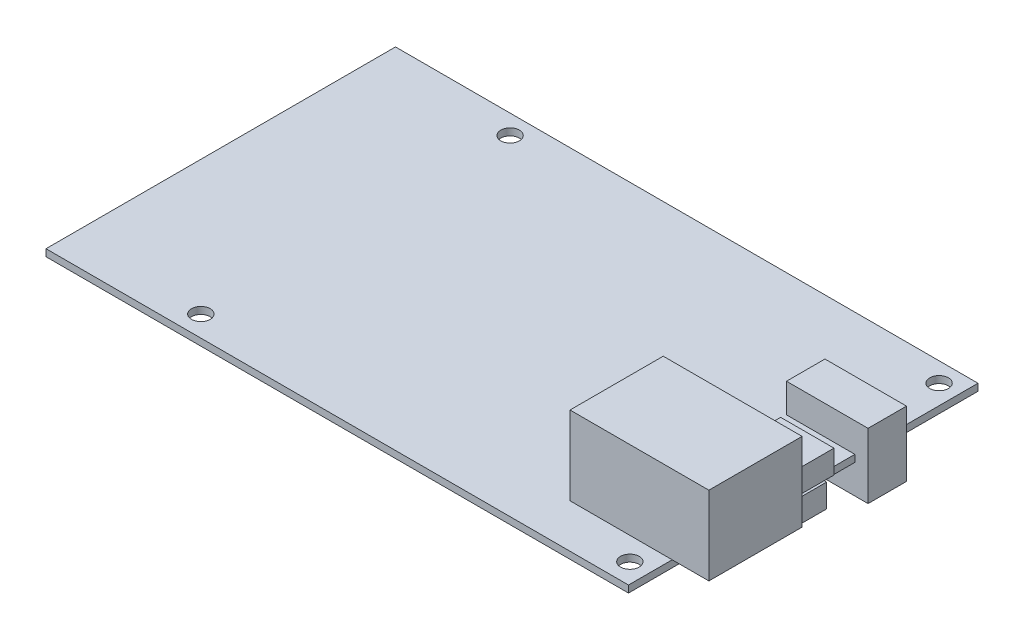
ISO-10303-21;
HEADER;
FILE_DESCRIPTION(('STEP AP214'),'2;1');
FILE_NAME('part.step','',(''),(''),'','','');
FILE_SCHEMA(('AUTOMOTIVE_DESIGN { 1 0 10303 214 1 1 1 1 }'));
ENDSEC;
DATA;
#1=APPLICATION_CONTEXT('core data for automotive mechanical design processes');
#2=APPLICATION_PROTOCOL_DEFINITION('international standard','automotive_design',2000,#1);
#3=PRODUCT_CONTEXT('',#1,'mechanical');
#4=PRODUCT('Part','Part','',(#3));
#5=PRODUCT_RELATED_PRODUCT_CATEGORY('part','',(#4));
#6=PRODUCT_DEFINITION_FORMATION('','',#4);
#7=PRODUCT_DEFINITION_CONTEXT('part definition',#1,'design');
#8=PRODUCT_DEFINITION('design','',#6,#7);
#9=PRODUCT_DEFINITION_SHAPE('','',#8);
#10=(LENGTH_UNIT() NAMED_UNIT(*) SI_UNIT(.MILLI.,.METRE.));
#11=(NAMED_UNIT(*) PLANE_ANGLE_UNIT() SI_UNIT($,.RADIAN.));
#12=(NAMED_UNIT(*) SI_UNIT($,.STERADIAN.) SOLID_ANGLE_UNIT());
#13=UNCERTAINTY_MEASURE_WITH_UNIT(LENGTH_MEASURE(1.E-05),#10,'distance_accuracy_value','');
#14=(GEOMETRIC_REPRESENTATION_CONTEXT(3) GLOBAL_UNCERTAINTY_ASSIGNED_CONTEXT((#13)) GLOBAL_UNIT_ASSIGNED_CONTEXT((#10,
#11,#12)) REPRESENTATION_CONTEXT('',''));
#15=CARTESIAN_POINT('',(0.,0.,0.));
#16=DIRECTION('',(0.,0.,1.));
#17=DIRECTION('',(1.,0.,0.));
#18=AXIS2_PLACEMENT_3D('',#15,#16,#17);
#19=CARTESIAN_POINT('',(0.,-1.2,0.));
#20=DIRECTION('',(0.,1.,0.));
#21=DIRECTION('',(0.,0.,1.));
#22=AXIS2_PLACEMENT_3D('',#19,#20,#21);
#23=PLANE('',#22);
#24=CARTESIAN_POINT('',(-3.349,-1.2,-3.581));
#25=DIRECTION('',(0.,1.,0.));
#26=DIRECTION('',(0.,0.,1.));
#27=AXIS2_PLACEMENT_3D('',#24,#25,#26);
#28=CIRCLE('',#27,1.6);
#29=CARTESIAN_POINT('',(-3.349,-1.2,-1.981));
#30=VERTEX_POINT('',#29);
#31=EDGE_CURVE('E243',#30,#30,#28,.F.);
#32=ORIENTED_EDGE('',*,*,#31,.F.);
#33=EDGE_LOOP('',(#32));
#34=FACE_BOUND('',#33,.T.);
#35=CARTESIAN_POINT('',(-3.35,-1.2,-56.673));
#36=DIRECTION('',(0.,1.,0.));
#37=DIRECTION('',(0.,0.,1.));
#38=AXIS2_PLACEMENT_3D('',#35,#36,#37);
#39=CIRCLE('',#38,1.6);
#40=CARTESIAN_POINT('',(-3.35,-1.2,-55.073));
#41=VERTEX_POINT('',#40);
#42=EDGE_CURVE('E249',#41,#41,#39,.F.);
#43=ORIENTED_EDGE('',*,*,#42,.F.);
#44=EDGE_LOOP('',(#43));
#45=FACE_BOUND('',#44,.T.);
#46=CARTESIAN_POINT('',(-77.,-1.2,-3.581));
#47=DIRECTION('',(0.,1.,0.));
#48=DIRECTION('',(0.,0.,1.));
#49=AXIS2_PLACEMENT_3D('',#46,#47,#48);
#50=CIRCLE('',#49,1.60000000000001);
#51=CARTESIAN_POINT('',(-77.,-1.2,-1.98099999999999));
#52=VERTEX_POINT('',#51);
#53=EDGE_CURVE('E255',#52,#52,#50,.F.);
#54=ORIENTED_EDGE('',*,*,#53,.F.);
#55=EDGE_LOOP('',(#54));
#56=FACE_BOUND('',#55,.T.);
#57=CARTESIAN_POINT('',(-77.,-1.2,-56.673));
#58=DIRECTION('',(0.,1.,0.));
#59=DIRECTION('',(0.,0.,1.));
#60=AXIS2_PLACEMENT_3D('',#57,#58,#59);
#61=CIRCLE('',#60,1.60000000000001);
#62=CARTESIAN_POINT('',(-77.,-1.2,-55.073));
#63=VERTEX_POINT('',#62);
#64=EDGE_CURVE('E261',#63,#63,#61,.F.);
#65=ORIENTED_EDGE('',*,*,#64,.F.);
#66=EDGE_LOOP('',(#65));
#67=FACE_BOUND('',#66,.T.);
#68=DIRECTION('',(1.,0.,0.));
#69=VECTOR('',#68,1.);
#70=CARTESIAN_POINT('',(-3.75,-1.2,-33.51));
#71=LINE('',#70,#69);
#72=CARTESIAN_POINT('',(-3.75,-1.2,-33.51));
#73=VERTEX_POINT('',#72);
#74=CARTESIAN_POINT('',(0.,-1.2,-33.51));
#75=VERTEX_POINT('',#74);
#76=EDGE_CURVE('E47',#73,#75,#71,.T.);
#77=ORIENTED_EDGE('',*,*,#76,.F.);
#78=DIRECTION('',(0.,0.,-1.));
#79=VECTOR('',#78,1.);
#80=CARTESIAN_POINT('',(-3.75,-1.2,-26.51));
#81=LINE('',#80,#79);
#82=CARTESIAN_POINT('',(-3.75,-1.2,-26.51));
#83=VERTEX_POINT('',#82);
#84=EDGE_CURVE('E264',#83,#73,#81,.T.);
#85=ORIENTED_EDGE('',*,*,#84,.F.);
#86=DIRECTION('',(-1.,0.,0.));
#87=VECTOR('',#86,1.);
#88=CARTESIAN_POINT('',(0.,-1.2,-26.51));
#89=LINE('',#88,#87);
#90=CARTESIAN_POINT('',(0.,-1.2,-26.51));
#91=VERTEX_POINT('',#90);
#92=EDGE_CURVE('E11',#91,#83,#89,.T.);
#93=ORIENTED_EDGE('',*,*,#92,.F.);
#94=DIRECTION('',(0.,0.,-1.));
#95=VECTOR('',#94,1.);
#96=CARTESIAN_POINT('',(0.,-1.2,-60.));
#97=LINE('',#96,#95);
#98=CARTESIAN_POINT('',(0.,-1.2,0.));
#99=VERTEX_POINT('',#98);
#100=EDGE_CURVE('E397',#99,#91,#97,.T.);
#101=ORIENTED_EDGE('',*,*,#100,.F.);
#102=DIRECTION('',(1.,0.,0.));
#103=VECTOR('',#102,1.);
#104=CARTESIAN_POINT('',(-100.,-1.2,0.));
#105=LINE('',#104,#103);
#106=CARTESIAN_POINT('',(-100.,-1.2,0.));
#107=VERTEX_POINT('',#106);
#108=EDGE_CURVE('E392',#107,#99,#105,.T.);
#109=ORIENTED_EDGE('',*,*,#108,.F.);
#110=DIRECTION('',(0.,0.,1.));
#111=VECTOR('',#110,1.);
#112=CARTESIAN_POINT('',(-100.,-1.2,-60.));
#113=LINE('',#112,#111);
#114=CARTESIAN_POINT('',(-100.,-1.2,-60.));
#115=VERTEX_POINT('',#114);
#116=EDGE_CURVE('E389',#115,#107,#113,.T.);
#117=ORIENTED_EDGE('',*,*,#116,.F.);
#118=DIRECTION('',(-1.,0.,0.));
#119=VECTOR('',#118,1.);
#120=CARTESIAN_POINT('',(-100.,-1.2,-60.));
#121=LINE('',#120,#119);
#122=CARTESIAN_POINT('',(0.,-1.2,-60.));
#123=VERTEX_POINT('',#122);
#124=EDGE_CURVE('E400',#123,#115,#121,.T.);
#125=ORIENTED_EDGE('',*,*,#124,.F.);
#126=CARTESIAN_POINT('',(0.,-1.2,-45.46));
#127=VERTEX_POINT('',#126);
#128=EDGE_CURVE('E396',#127,#123,#97,.T.);
#129=ORIENTED_EDGE('',*,*,#128,.F.);
#130=DIRECTION('',(-1.,0.,0.));
#131=VECTOR('',#130,1.);
#132=CARTESIAN_POINT('',(0.,-1.2,-45.46));
#133=LINE('',#132,#131);
#134=CARTESIAN_POINT('',(-11.736,-1.2,-45.46));
#135=VERTEX_POINT('',#134);
#136=EDGE_CURVE('E40',#127,#135,#133,.T.);
#137=ORIENTED_EDGE('',*,*,#136,.T.);
#138=DIRECTION('',(0.,0.,1.));
#139=VECTOR('',#138,1.);
#140=CARTESIAN_POINT('',(-11.736,-1.2,0.));
#141=LINE('',#140,#139);
#142=CARTESIAN_POINT('',(-11.736,-1.2,-38.86));
#143=VERTEX_POINT('',#142);
#144=EDGE_CURVE('E429',#135,#143,#141,.T.);
#145=ORIENTED_EDGE('',*,*,#144,.T.);
#146=DIRECTION('',(1.,0.,0.));
#147=VECTOR('',#146,1.);
#148=CARTESIAN_POINT('',(0.,-1.2,-38.86));
#149=LINE('',#148,#147);
#150=CARTESIAN_POINT('',(0.,-1.2,-38.86));
#151=VERTEX_POINT('',#150);
#152=EDGE_CURVE('E427',#143,#151,#149,.T.);
#153=ORIENTED_EDGE('',*,*,#152,.T.);
#154=EDGE_CURVE('E52',#75,#151,#97,.T.);
#155=ORIENTED_EDGE('',*,*,#154,.F.);
#156=EDGE_LOOP('',(#77,#85,#93,#101,#109,#117,#125,#129,#137,#145,#153,#155));
#157=FACE_BOUND('',#156,.T.);
#158=ADVANCED_FACE('F32',(#34,#45,#56,#67,#157),#23,.F.);
#159=CARTESIAN_POINT('',(0.,-1.2,-60.));
#160=DIRECTION('',(1.,0.,0.));
#161=DIRECTION('',(0.,0.,-1.));
#162=AXIS2_PLACEMENT_3D('',#159,#160,#161);
#163=PLANE('',#162);
#164=DIRECTION('',(0.,1.,0.));
#165=VECTOR('',#164,1.);
#166=CARTESIAN_POINT('',(0.,-1.2,-45.46));
#167=LINE('',#166,#165);
#168=CARTESIAN_POINT('',(0.,0.,-45.46));
#169=VERTEX_POINT('',#168);
#170=EDGE_CURVE('E335',#127,#169,#167,.T.);
#171=ORIENTED_EDGE('',*,*,#170,.F.);
#172=ORIENTED_EDGE('',*,*,#128,.T.);
#173=DIRECTION('',(0.,1.,0.));
#174=VECTOR('',#173,1.);
#175=CARTESIAN_POINT('',(0.,-1.2,-60.));
#176=LINE('',#175,#174);
#177=CARTESIAN_POINT('',(0.,0.,-60.));
#178=VERTEX_POINT('',#177);
#179=EDGE_CURVE('E418',#123,#178,#176,.T.);
#180=ORIENTED_EDGE('',*,*,#179,.T.);
#181=DIRECTION('',(0.,0.,-1.));
#182=VECTOR('',#181,1.);
#183=CARTESIAN_POINT('',(0.,0.,-60.));
#184=LINE('',#183,#182);
#185=EDGE_CURVE('E410',#169,#178,#184,.T.);
#186=ORIENTED_EDGE('',*,*,#185,.F.);
#187=EDGE_LOOP('',(#171,#172,#180,#186));
#188=FACE_BOUND('',#187,.T.);
#189=ADVANCED_FACE('F440',(#188),#163,.T.);
#190=CARTESIAN_POINT('',(0.,0.,0.));
#191=DIRECTION('',(0.,1.,0.));
#192=DIRECTION('',(0.,0.,1.));
#193=AXIS2_PLACEMENT_3D('',#190,#191,#192);
#194=PLANE('',#193);
#195=CARTESIAN_POINT('',(-3.349,0.,-3.581));
#196=DIRECTION('',(0.,1.,0.));
#197=DIRECTION('',(0.,0.,1.));
#198=AXIS2_PLACEMENT_3D('',#195,#196,#197);
#199=CIRCLE('',#198,1.6);
#200=CARTESIAN_POINT('',(-3.349,0.,-1.981));
#201=VERTEX_POINT('',#200);
#202=EDGE_CURVE('E240',#201,#201,#199,.T.);
#203=ORIENTED_EDGE('',*,*,#202,.F.);
#204=EDGE_LOOP('',(#203));
#205=FACE_BOUND('',#204,.T.);
#206=CARTESIAN_POINT('',(-3.35,0.,-56.673));
#207=DIRECTION('',(0.,1.,0.));
#208=DIRECTION('',(0.,0.,1.));
#209=AXIS2_PLACEMENT_3D('',#206,#207,#208);
#210=CIRCLE('',#209,1.6);
#211=CARTESIAN_POINT('',(-3.35,0.,-55.073));
#212=VERTEX_POINT('',#211);
#213=EDGE_CURVE('E246',#212,#212,#210,.T.);
#214=ORIENTED_EDGE('',*,*,#213,.F.);
#215=EDGE_LOOP('',(#214));
#216=FACE_BOUND('',#215,.T.);
#217=CARTESIAN_POINT('',(-77.,0.,-3.581));
#218=DIRECTION('',(0.,1.,0.));
#219=DIRECTION('',(0.,0.,1.));
#220=AXIS2_PLACEMENT_3D('',#217,#218,#219);
#221=CIRCLE('',#220,1.60000000000001);
#222=CARTESIAN_POINT('',(-77.,0.,-1.98099999999999));
#223=VERTEX_POINT('',#222);
#224=EDGE_CURVE('E252',#223,#223,#221,.T.);
#225=ORIENTED_EDGE('',*,*,#224,.F.);
#226=EDGE_LOOP('',(#225));
#227=FACE_BOUND('',#226,.T.);
#228=CARTESIAN_POINT('',(-77.,0.,-56.673));
#229=DIRECTION('',(0.,1.,0.));
#230=DIRECTION('',(0.,0.,1.));
#231=AXIS2_PLACEMENT_3D('',#228,#229,#230);
#232=CIRCLE('',#231,1.60000000000001);
#233=CARTESIAN_POINT('',(-77.,0.,-55.073));
#234=VERTEX_POINT('',#233);
#235=EDGE_CURVE('E258',#234,#234,#232,.T.);
#236=ORIENTED_EDGE('',*,*,#235,.F.);
#237=EDGE_LOOP('',(#236));
#238=FACE_BOUND('',#237,.T.);
#239=DIRECTION('',(-1.,0.,0.));
#240=VECTOR('',#239,1.);
#241=CARTESIAN_POINT('',(0.,0.,-45.46));
#242=LINE('',#241,#240);
#243=CARTESIAN_POINT('',(-11.736,0.,-45.46));
#244=VERTEX_POINT('',#243);
#245=EDGE_CURVE('E337',#169,#244,#242,.T.);
#246=ORIENTED_EDGE('',*,*,#245,.F.);
#247=ORIENTED_EDGE('',*,*,#185,.T.);
#248=DIRECTION('',(-1.,0.,0.));
#249=VECTOR('',#248,1.);
#250=CARTESIAN_POINT('',(-100.,0.,-60.));
#251=LINE('',#250,#249);
#252=CARTESIAN_POINT('',(-100.,0.,-60.));
#253=VERTEX_POINT('',#252);
#254=EDGE_CURVE('E393',#178,#253,#251,.T.);
#255=ORIENTED_EDGE('',*,*,#254,.T.);
#256=DIRECTION('',(0.,0.,1.));
#257=VECTOR('',#256,1.);
#258=CARTESIAN_POINT('',(-100.,0.,-60.));
#259=LINE('',#258,#257);
#260=CARTESIAN_POINT('',(-100.,0.,0.));
#261=VERTEX_POINT('',#260);
#262=EDGE_CURVE('E388',#253,#261,#259,.T.);
#263=ORIENTED_EDGE('',*,*,#262,.T.);
#264=DIRECTION('',(1.,0.,0.));
#265=VECTOR('',#264,1.);
#266=CARTESIAN_POINT('',(-100.,0.,0.));
#267=LINE('',#266,#265);
#268=CARTESIAN_POINT('',(0.,0.,0.));
#269=VERTEX_POINT('',#268);
#270=EDGE_CURVE('E407',#261,#269,#267,.T.);
#271=ORIENTED_EDGE('',*,*,#270,.T.);
#272=CARTESIAN_POINT('',(0.,0.,-7.5));
#273=VERTEX_POINT('',#272);
#274=EDGE_CURVE('E411',#269,#273,#184,.T.);
#275=ORIENTED_EDGE('',*,*,#274,.T.);
#276=DIRECTION('',(1.,0.,0.));
#277=VECTOR('',#276,1.);
#278=CARTESIAN_POINT('',(-17.54,0.,-7.5));
#279=LINE('',#278,#277);
#280=CARTESIAN_POINT('',(-17.54,0.,-7.5));
#281=VERTEX_POINT('',#280);
#282=EDGE_CURVE('E217',#281,#273,#279,.T.);
#283=ORIENTED_EDGE('',*,*,#282,.F.);
#284=DIRECTION('',(0.,0.,1.));
#285=VECTOR('',#284,1.);
#286=CARTESIAN_POINT('',(-17.54,0.,-7.5));
#287=LINE('',#286,#285);
#288=CARTESIAN_POINT('',(-17.54,0.,-23.5));
#289=VERTEX_POINT('',#288);
#290=EDGE_CURVE('E220',#289,#281,#287,.T.);
#291=ORIENTED_EDGE('',*,*,#290,.F.);
#292=DIRECTION('',(-1.,0.,0.));
#293=VECTOR('',#292,1.);
#294=CARTESIAN_POINT('',(-17.54,0.,-23.5));
#295=LINE('',#294,#293);
#296=CARTESIAN_POINT('',(0.,0.,-23.5));
#297=VERTEX_POINT('',#296);
#298=EDGE_CURVE('E383',#297,#289,#295,.T.);
#299=ORIENTED_EDGE('',*,*,#298,.F.);
#300=CARTESIAN_POINT('',(0.,0.,-26.37));
#301=VERTEX_POINT('',#300);
#302=EDGE_CURVE('E450',#297,#301,#184,.T.);
#303=ORIENTED_EDGE('',*,*,#302,.T.);
#304=DIRECTION('',(1.,0.,0.));
#305=VECTOR('',#304,1.);
#306=CARTESIAN_POINT('',(-7.87,0.,-26.37));
#307=LINE('',#306,#305);
#308=CARTESIAN_POINT('',(-7.87,0.,-26.37));
#309=VERTEX_POINT('',#308);
#310=EDGE_CURVE('E356',#309,#301,#307,.T.);
#311=ORIENTED_EDGE('',*,*,#310,.F.);
#312=DIRECTION('',(0.,0.,1.));
#313=VECTOR('',#312,1.);
#314=CARTESIAN_POINT('',(-7.87,0.,-33.99));
#315=LINE('',#314,#313);
#316=CARTESIAN_POINT('',(-7.87,0.,-33.99));
#317=VERTEX_POINT('',#316);
#318=EDGE_CURVE('E341',#317,#309,#315,.T.);
#319=ORIENTED_EDGE('',*,*,#318,.F.);
#320=DIRECTION('',(1.,0.,0.));
#321=VECTOR('',#320,1.);
#322=CARTESIAN_POINT('',(0.,0.,-33.99));
#323=LINE('',#322,#321);
#324=CARTESIAN_POINT('',(0.,0.,-33.99));
#325=VERTEX_POINT('',#324);
#326=EDGE_CURVE('E424',#317,#325,#323,.T.);
#327=ORIENTED_EDGE('',*,*,#326,.T.);
#328=CARTESIAN_POINT('',(0.,0.,-38.86));
#329=VERTEX_POINT('',#328);
#330=EDGE_CURVE('E444',#325,#329,#184,.T.);
#331=ORIENTED_EDGE('',*,*,#330,.T.);
#332=DIRECTION('',(1.,0.,0.));
#333=VECTOR('',#332,1.);
#334=CARTESIAN_POINT('',(0.,0.,-38.86));
#335=LINE('',#334,#333);
#336=CARTESIAN_POINT('',(-11.736,0.,-38.86));
#337=VERTEX_POINT('',#336);
#338=EDGE_CURVE('E333',#337,#329,#335,.T.);
#339=ORIENTED_EDGE('',*,*,#338,.F.);
#340=DIRECTION('',(0.,0.,1.));
#341=VECTOR('',#340,1.);
#342=CARTESIAN_POINT('',(-11.736,0.,0.));
#343=LINE('',#342,#341);
#344=EDGE_CURVE('E339',#244,#337,#343,.T.);
#345=ORIENTED_EDGE('',*,*,#344,.F.);
#346=EDGE_LOOP('',(#246,#247,#255,#263,#271,#275,#283,#291,#299,#303,#311,#319,#327,#331,#339,#345));
#347=FACE_BOUND('',#346,.T.);
#348=ADVANCED_FACE('F470',(#205,#216,#227,#238,#347),#194,.T.);
#349=CARTESIAN_POINT('',(-100.,-1.2,-60.));
#350=DIRECTION('',(-1.,0.,0.));
#351=DIRECTION('',(0.,0.,1.));
#352=AXIS2_PLACEMENT_3D('',#349,#350,#351);
#353=PLANE('',#352);
#354=ORIENTED_EDGE('',*,*,#262,.F.);
#355=DIRECTION('',(0.,1.,0.));
#356=VECTOR('',#355,1.);
#357=CARTESIAN_POINT('',(-100.,-1.2,-60.));
#358=LINE('',#357,#356);
#359=EDGE_CURVE('E416',#115,#253,#358,.T.);
#360=ORIENTED_EDGE('',*,*,#359,.F.);
#361=ORIENTED_EDGE('',*,*,#116,.T.);
#362=DIRECTION('',(0.,1.,0.));
#363=VECTOR('',#362,1.);
#364=CARTESIAN_POINT('',(-100.,-1.2,0.));
#365=LINE('',#364,#363);
#366=EDGE_CURVE('E404',#107,#261,#365,.T.);
#367=ORIENTED_EDGE('',*,*,#366,.T.);
#368=EDGE_LOOP('',(#354,#360,#361,#367));
#369=FACE_BOUND('',#368,.T.);
#370=ADVANCED_FACE('F34',(#369),#353,.T.);
#371=CARTESIAN_POINT('',(-100.,-1.2,-60.));
#372=DIRECTION('',(0.,0.,-1.));
#373=DIRECTION('',(-1.,0.,0.));
#374=AXIS2_PLACEMENT_3D('',#371,#372,#373);
#375=PLANE('',#374);
#376=ORIENTED_EDGE('',*,*,#254,.F.);
#377=ORIENTED_EDGE('',*,*,#179,.F.);
#378=ORIENTED_EDGE('',*,*,#124,.T.);
#379=ORIENTED_EDGE('',*,*,#359,.T.);
#380=EDGE_LOOP('',(#376,#377,#378,#379));
#381=FACE_BOUND('',#380,.T.);
#382=ADVANCED_FACE('F483',(#381),#375,.T.);
#383=DIRECTION('',(0.,-1.,0.));
#384=VECTOR('',#383,1.);
#385=CARTESIAN_POINT('',(0.,-1.2,-38.86));
#386=LINE('',#385,#384);
#387=EDGE_CURVE('E322',#329,#151,#386,.T.);
#388=ORIENTED_EDGE('',*,*,#387,.F.);
#389=ORIENTED_EDGE('',*,*,#330,.F.);
#390=EDGE_CURVE('E446',#301,#325,#184,.T.);
#391=ORIENTED_EDGE('',*,*,#390,.F.);
#392=ORIENTED_EDGE('',*,*,#302,.F.);
#393=EDGE_CURVE('E413',#273,#297,#184,.T.);
#394=ORIENTED_EDGE('',*,*,#393,.F.);
#395=ORIENTED_EDGE('',*,*,#274,.F.);
#396=DIRECTION('',(0.,1.,0.));
#397=VECTOR('',#396,1.);
#398=CARTESIAN_POINT('',(0.,-1.2,0.));
#399=LINE('',#398,#397);
#400=EDGE_CURVE('E421',#99,#269,#399,.T.);
#401=ORIENTED_EDGE('',*,*,#400,.F.);
#402=ORIENTED_EDGE('',*,*,#100,.T.);
#403=EDGE_CURVE('E401',#91,#75,#97,.T.);
#404=ORIENTED_EDGE('',*,*,#403,.T.);
#405=ORIENTED_EDGE('',*,*,#154,.T.);
#406=EDGE_LOOP('',(#388,#389,#391,#392,#394,#395,#401,#402,#404,#405));
#407=FACE_BOUND('',#406,.T.);
#408=ADVANCED_FACE('F473',(#407),#163,.T.);
#409=CARTESIAN_POINT('',(-100.,-1.2,0.));
#410=DIRECTION('',(0.,0.,1.));
#411=DIRECTION('',(1.,0.,0.));
#412=AXIS2_PLACEMENT_3D('',#409,#410,#411);
#413=PLANE('',#412);
#414=ORIENTED_EDGE('',*,*,#270,.F.);
#415=ORIENTED_EDGE('',*,*,#366,.F.);
#416=ORIENTED_EDGE('',*,*,#108,.T.);
#417=ORIENTED_EDGE('',*,*,#400,.T.);
#418=EDGE_LOOP('',(#414,#415,#416,#417));
#419=FACE_BOUND('',#418,.T.);
#420=ADVANCED_FACE('F479',(#419),#413,.T.);
#421=CARTESIAN_POINT('',(-17.54,13.5,-7.5));
#422=DIRECTION('',(1.,0.,0.));
#423=DIRECTION('',(0.,0.,-1.));
#424=AXIS2_PLACEMENT_3D('',#421,#422,#423);
#425=PLANE('',#424);
#426=ORIENTED_EDGE('',*,*,#290,.T.);
#427=DIRECTION('',(0.,-1.,0.));
#428=VECTOR('',#427,1.);
#429=CARTESIAN_POINT('',(-17.54,13.5,-7.5));
#430=LINE('',#429,#428);
#431=CARTESIAN_POINT('',(-17.54,13.5,-7.5));
#432=VERTEX_POINT('',#431);
#433=EDGE_CURVE('E386',#432,#281,#430,.T.);
#434=ORIENTED_EDGE('',*,*,#433,.F.);
#435=DIRECTION('',(0.,0.,1.));
#436=VECTOR('',#435,1.);
#437=CARTESIAN_POINT('',(-17.54,13.5,-7.5));
#438=LINE('',#437,#436);
#439=CARTESIAN_POINT('',(-17.54,13.5,-23.5));
#440=VERTEX_POINT('',#439);
#441=EDGE_CURVE('E372',#440,#432,#438,.T.);
#442=ORIENTED_EDGE('',*,*,#441,.F.);
#443=DIRECTION('',(0.,-1.,0.));
#444=VECTOR('',#443,1.);
#445=CARTESIAN_POINT('',(-17.54,13.5,-23.5));
#446=LINE('',#445,#444);
#447=EDGE_CURVE('E379',#440,#289,#446,.T.);
#448=ORIENTED_EDGE('',*,*,#447,.T.);
#449=EDGE_LOOP('',(#426,#434,#442,#448));
#450=FACE_BOUND('',#449,.T.);
#451=ADVANCED_FACE('F469',(#450),#425,.F.);
#452=CARTESIAN_POINT('',(-17.54,13.5,-7.5));
#453=DIRECTION('',(0.,0.,-1.));
#454=DIRECTION('',(-1.,0.,0.));
#455=AXIS2_PLACEMENT_3D('',#452,#453,#454);
#456=PLANE('',#455);
#457=ORIENTED_EDGE('',*,*,#282,.T.);
#458=CARTESIAN_POINT('',(6.3,0.,-7.5));
#459=VERTEX_POINT('',#458);
#460=EDGE_CURVE('E211',#273,#459,#279,.T.);
#461=ORIENTED_EDGE('',*,*,#460,.T.);
#462=DIRECTION('',(0.,-1.,0.));
#463=VECTOR('',#462,1.);
#464=CARTESIAN_POINT('',(6.3,13.5,-7.5));
#465=LINE('',#464,#463);
#466=CARTESIAN_POINT('',(6.3,13.5,-7.5));
#467=VERTEX_POINT('',#466);
#468=EDGE_CURVE('E215',#467,#459,#465,.T.);
#469=ORIENTED_EDGE('',*,*,#468,.F.);
#470=DIRECTION('',(1.,0.,0.));
#471=VECTOR('',#470,1.);
#472=CARTESIAN_POINT('',(-17.54,13.5,-7.5));
#473=LINE('',#472,#471);
#474=EDGE_CURVE('E375',#432,#467,#473,.T.);
#475=ORIENTED_EDGE('',*,*,#474,.F.);
#476=ORIENTED_EDGE('',*,*,#433,.T.);
#477=EDGE_LOOP('',(#457,#461,#469,#475,#476));
#478=FACE_BOUND('',#477,.T.);
#479=ADVANCED_FACE('F213',(#478),#456,.F.);
#480=CARTESIAN_POINT('',(-17.54,13.5,-23.5));
#481=DIRECTION('',(0.,0.,1.));
#482=DIRECTION('',(1.,0.,0.));
#483=AXIS2_PLACEMENT_3D('',#480,#481,#482);
#484=PLANE('',#483);
#485=CARTESIAN_POINT('',(6.3,0.,-23.5));
#486=VERTEX_POINT('',#485);
#487=EDGE_CURVE('E226',#486,#297,#295,.T.);
#488=ORIENTED_EDGE('',*,*,#487,.T.);
#489=ORIENTED_EDGE('',*,*,#298,.T.);
#490=ORIENTED_EDGE('',*,*,#447,.F.);
#491=DIRECTION('',(-1.,0.,0.));
#492=VECTOR('',#491,1.);
#493=CARTESIAN_POINT('',(-17.54,13.5,-23.5));
#494=LINE('',#493,#492);
#495=CARTESIAN_POINT('',(6.3,13.5,-23.5));
#496=VERTEX_POINT('',#495);
#497=EDGE_CURVE('E377',#496,#440,#494,.T.);
#498=ORIENTED_EDGE('',*,*,#497,.F.);
#499=DIRECTION('',(0.,1.,0.));
#500=VECTOR('',#499,1.);
#501=CARTESIAN_POINT('',(6.3,13.5,-23.5));
#502=LINE('',#501,#500);
#503=EDGE_CURVE('E230',#486,#496,#502,.T.);
#504=ORIENTED_EDGE('',*,*,#503,.F.);
#505=EDGE_LOOP('',(#488,#489,#490,#498,#504));
#506=FACE_BOUND('',#505,.T.);
#507=ADVANCED_FACE('F462',(#506),#484,.F.);
#508=CARTESIAN_POINT('',(0.,13.5,0.));
#509=DIRECTION('',(0.,-1.,0.));
#510=DIRECTION('',(0.,0.,-1.));
#511=AXIS2_PLACEMENT_3D('',#508,#509,#510);
#512=PLANE('',#511);
#513=ORIENTED_EDGE('',*,*,#441,.T.);
#514=ORIENTED_EDGE('',*,*,#474,.T.);
#515=DIRECTION('',(0.,0.,1.));
#516=VECTOR('',#515,1.);
#517=CARTESIAN_POINT('',(6.3,13.5,-7.5));
#518=LINE('',#517,#516);
#519=EDGE_CURVE('E235',#496,#467,#518,.T.);
#520=ORIENTED_EDGE('',*,*,#519,.F.);
#521=ORIENTED_EDGE('',*,*,#497,.T.);
#522=EDGE_LOOP('',(#513,#514,#520,#521));
#523=FACE_BOUND('',#522,.T.);
#524=ADVANCED_FACE('F465',(#523),#512,.F.);
#525=CARTESIAN_POINT('',(0.,0.,0.));
#526=DIRECTION('',(0.,-1.,0.));
#527=DIRECTION('',(0.,0.,-1.));
#528=AXIS2_PLACEMENT_3D('',#525,#526,#527);
#529=PLANE('',#528);
#530=ORIENTED_EDGE('',*,*,#460,.F.);
#531=ORIENTED_EDGE('',*,*,#393,.T.);
#532=ORIENTED_EDGE('',*,*,#487,.F.);
#533=DIRECTION('',(0.,0.,-1.));
#534=VECTOR('',#533,1.);
#535=CARTESIAN_POINT('',(6.3,0.,-7.5));
#536=LINE('',#535,#534);
#537=EDGE_CURVE('E223',#459,#486,#536,.T.);
#538=ORIENTED_EDGE('',*,*,#537,.F.);
#539=EDGE_LOOP('',(#530,#531,#532,#538));
#540=FACE_BOUND('',#539,.T.);
#541=ADVANCED_FACE('F224',(#540),#529,.T.);
#542=CARTESIAN_POINT('',(-7.87,4.,-33.99));
#543=DIRECTION('',(1.,0.,0.));
#544=DIRECTION('',(0.,0.,-1.));
#545=AXIS2_PLACEMENT_3D('',#542,#543,#544);
#546=PLANE('',#545);
#547=ORIENTED_EDGE('',*,*,#318,.T.);
#548=DIRECTION('',(0.,-1.,0.));
#549=VECTOR('',#548,1.);
#550=CARTESIAN_POINT('',(-7.87,4.,-26.37));
#551=LINE('',#550,#549);
#552=CARTESIAN_POINT('',(-7.87,4.,-26.37));
#553=VERTEX_POINT('',#552);
#554=EDGE_CURVE('E370',#553,#309,#551,.T.);
#555=ORIENTED_EDGE('',*,*,#554,.F.);
#556=DIRECTION('',(0.,0.,1.));
#557=VECTOR('',#556,1.);
#558=CARTESIAN_POINT('',(-7.87,4.,-33.99));
#559=LINE('',#558,#557);
#560=CARTESIAN_POINT('',(-7.87,4.,-33.99));
#561=VERTEX_POINT('',#560);
#562=EDGE_CURVE('E342',#561,#553,#559,.T.);
#563=ORIENTED_EDGE('',*,*,#562,.F.);
#564=DIRECTION('',(0.,-1.,0.));
#565=VECTOR('',#564,1.);
#566=CARTESIAN_POINT('',(-7.87,4.,-33.99));
#567=LINE('',#566,#565);
#568=EDGE_CURVE('E352',#561,#317,#567,.T.);
#569=ORIENTED_EDGE('',*,*,#568,.T.);
#570=EDGE_LOOP('',(#547,#555,#563,#569));
#571=FACE_BOUND('',#570,.T.);
#572=ADVANCED_FACE('F596',(#571),#546,.F.);
#573=CARTESIAN_POINT('',(-7.87,4.,-26.37));
#574=DIRECTION('',(0.,0.,-1.));
#575=DIRECTION('',(-1.,0.,0.));
#576=AXIS2_PLACEMENT_3D('',#573,#574,#575);
#577=PLANE('',#576);
#578=ORIENTED_EDGE('',*,*,#310,.T.);
#579=CARTESIAN_POINT('',(1.29,0.,-26.37));
#580=VERTEX_POINT('',#579);
#581=EDGE_CURVE('E355',#301,#580,#307,.T.);
#582=ORIENTED_EDGE('',*,*,#581,.T.);
#583=DIRECTION('',(0.,-1.,0.));
#584=VECTOR('',#583,1.);
#585=CARTESIAN_POINT('',(1.29,4.,-26.37));
#586=LINE('',#585,#584);
#587=CARTESIAN_POINT('',(1.29,4.,-26.37));
#588=VERTEX_POINT('',#587);
#589=EDGE_CURVE('E367',#588,#580,#586,.T.);
#590=ORIENTED_EDGE('',*,*,#589,.F.);
#591=DIRECTION('',(1.,0.,0.));
#592=VECTOR('',#591,1.);
#593=CARTESIAN_POINT('',(-7.87,4.,-26.37));
#594=LINE('',#593,#592);
#595=EDGE_CURVE('E345',#553,#588,#594,.T.);
#596=ORIENTED_EDGE('',*,*,#595,.F.);
#597=ORIENTED_EDGE('',*,*,#554,.T.);
#598=EDGE_LOOP('',(#578,#582,#590,#596,#597));
#599=FACE_BOUND('',#598,.T.);
#600=ADVANCED_FACE('F592',(#599),#577,.F.);
#601=CARTESIAN_POINT('',(1.29,4.,-33.99));
#602=DIRECTION('',(-1.,0.,0.));
#603=DIRECTION('',(0.,0.,1.));
#604=AXIS2_PLACEMENT_3D('',#601,#602,#603);
#605=PLANE('',#604);
#606=DIRECTION('',(0.,0.,-1.));
#607=VECTOR('',#606,1.);
#608=CARTESIAN_POINT('',(1.29,0.,-33.99));
#609=LINE('',#608,#607);
#610=CARTESIAN_POINT('',(1.29,0.,-33.99));
#611=VERTEX_POINT('',#610);
#612=EDGE_CURVE('E359',#580,#611,#609,.T.);
#613=ORIENTED_EDGE('',*,*,#612,.T.);
#614=DIRECTION('',(0.,-1.,0.));
#615=VECTOR('',#614,1.);
#616=CARTESIAN_POINT('',(1.29,4.,-33.99));
#617=LINE('',#616,#615);
#618=CARTESIAN_POINT('',(1.29,4.,-33.99));
#619=VERTEX_POINT('',#618);
#620=EDGE_CURVE('E364',#619,#611,#617,.T.);
#621=ORIENTED_EDGE('',*,*,#620,.F.);
#622=DIRECTION('',(0.,0.,-1.));
#623=VECTOR('',#622,1.);
#624=CARTESIAN_POINT('',(1.29,4.,-33.99));
#625=LINE('',#624,#623);
#626=EDGE_CURVE('E348',#588,#619,#625,.T.);
#627=ORIENTED_EDGE('',*,*,#626,.F.);
#628=ORIENTED_EDGE('',*,*,#589,.T.);
#629=EDGE_LOOP('',(#613,#621,#627,#628));
#630=FACE_BOUND('',#629,.T.);
#631=ADVANCED_FACE('F588',(#630),#605,.F.);
#632=CARTESIAN_POINT('',(-7.87,4.,-33.99));
#633=DIRECTION('',(0.,0.,1.));
#634=DIRECTION('',(1.,0.,0.));
#635=AXIS2_PLACEMENT_3D('',#632,#633,#634);
#636=PLANE('',#635);
#637=DIRECTION('',(-1.,0.,0.));
#638=VECTOR('',#637,1.);
#639=CARTESIAN_POINT('',(-7.87,0.,-33.99));
#640=LINE('',#639,#638);
#641=EDGE_CURVE('E346',#611,#325,#640,.T.);
#642=ORIENTED_EDGE('',*,*,#641,.T.);
#643=ORIENTED_EDGE('',*,*,#326,.F.);
#644=ORIENTED_EDGE('',*,*,#568,.F.);
#645=DIRECTION('',(-1.,0.,0.));
#646=VECTOR('',#645,1.);
#647=CARTESIAN_POINT('',(-7.87,4.,-33.99));
#648=LINE('',#647,#646);
#649=EDGE_CURVE('E350',#619,#561,#648,.T.);
#650=ORIENTED_EDGE('',*,*,#649,.F.);
#651=ORIENTED_EDGE('',*,*,#620,.T.);
#652=EDGE_LOOP('',(#642,#643,#644,#650,#651));
#653=FACE_BOUND('',#652,.T.);
#654=ADVANCED_FACE('F582',(#653),#636,.F.);
#655=CARTESIAN_POINT('',(0.,4.,0.));
#656=DIRECTION('',(0.,1.,0.));
#657=DIRECTION('',(0.,0.,1.));
#658=AXIS2_PLACEMENT_3D('',#655,#656,#657);
#659=PLANE('',#658);
#660=ORIENTED_EDGE('',*,*,#562,.T.);
#661=ORIENTED_EDGE('',*,*,#595,.T.);
#662=ORIENTED_EDGE('',*,*,#626,.T.);
#663=ORIENTED_EDGE('',*,*,#649,.T.);
#664=EDGE_LOOP('',(#660,#661,#662,#663));
#665=FACE_BOUND('',#664,.T.);
#666=ADVANCED_FACE('F578',(#665),#659,.T.);
#667=CARTESIAN_POINT('',(0.,0.,0.));
#668=DIRECTION('',(0.,1.,0.));
#669=DIRECTION('',(0.,0.,1.));
#670=AXIS2_PLACEMENT_3D('',#667,#668,#669);
#671=PLANE('',#670);
#672=ORIENTED_EDGE('',*,*,#390,.T.);
#673=ORIENTED_EDGE('',*,*,#641,.F.);
#674=ORIENTED_EDGE('',*,*,#612,.F.);
#675=ORIENTED_EDGE('',*,*,#581,.F.);
#676=EDGE_LOOP('',(#672,#673,#674,#675));
#677=FACE_BOUND('',#676,.T.);
#678=ADVANCED_FACE('F581',(#677),#671,.F.);
#679=CARTESIAN_POINT('',(-11.736,-6.2,-45.46));
#680=DIRECTION('',(-1.,0.,0.));
#681=DIRECTION('',(0.,0.,1.));
#682=AXIS2_PLACEMENT_3D('',#679,#680,#681);
#683=PLANE('',#682);
#684=ORIENTED_EDGE('',*,*,#144,.F.);
#685=DIRECTION('',(0.,1.,0.));
#686=VECTOR('',#685,1.);
#687=CARTESIAN_POINT('',(-11.736,-6.2,-45.46));
#688=LINE('',#687,#686);
#689=CARTESIAN_POINT('',(-11.736,-6.2,-45.46));
#690=VERTEX_POINT('',#689);
#691=EDGE_CURVE('E319',#690,#135,#688,.T.);
#692=ORIENTED_EDGE('',*,*,#691,.F.);
#693=DIRECTION('',(0.,0.,1.));
#694=VECTOR('',#693,1.);
#695=CARTESIAN_POINT('',(-11.736,-6.2,-45.46));
#696=LINE('',#695,#694);
#697=CARTESIAN_POINT('',(-11.736,-6.2,-38.86));
#698=VERTEX_POINT('',#697);
#699=EDGE_CURVE('E306',#690,#698,#696,.T.);
#700=ORIENTED_EDGE('',*,*,#699,.T.);
#701=DIRECTION('',(0.,1.,0.));
#702=VECTOR('',#701,1.);
#703=CARTESIAN_POINT('',(-11.736,-6.2,-38.86));
#704=LINE('',#703,#702);
#705=EDGE_CURVE('E328',#698,#143,#704,.T.);
#706=ORIENTED_EDGE('',*,*,#705,.T.);
#707=EDGE_LOOP('',(#684,#692,#700,#706));
#708=FACE_BOUND('',#707,.T.);
#709=ADVANCED_FACE('F576',(#708),#683,.T.);
#710=CARTESIAN_POINT('',(-11.736,5.,-45.46));
#711=VERTEX_POINT('',#710);
#712=EDGE_CURVE('E323',#244,#711,#688,.T.);
#713=ORIENTED_EDGE('',*,*,#712,.F.);
#714=ORIENTED_EDGE('',*,*,#344,.T.);
#715=CARTESIAN_POINT('',(-11.736,5.,-38.86));
#716=VERTEX_POINT('',#715);
#717=EDGE_CURVE('E318',#337,#716,#704,.T.);
#718=ORIENTED_EDGE('',*,*,#717,.T.);
#719=DIRECTION('',(0.,0.,1.));
#720=VECTOR('',#719,1.);
#721=CARTESIAN_POINT('',(-11.736,5.,-45.46));
#722=LINE('',#721,#720);
#723=EDGE_CURVE('E294',#711,#716,#722,.T.);
#724=ORIENTED_EDGE('',*,*,#723,.F.);
#725=EDGE_LOOP('',(#713,#714,#718,#724));
#726=FACE_BOUND('',#725,.T.);
#727=ADVANCED_FACE('F567',(#726),#683,.T.);
#728=CARTESIAN_POINT('',(-11.736,-6.2,-45.46));
#729=DIRECTION('',(0.,0.,-1.));
#730=DIRECTION('',(-1.,0.,0.));
#731=AXIS2_PLACEMENT_3D('',#728,#729,#730);
#732=PLANE('',#731);
#733=ORIENTED_EDGE('',*,*,#170,.T.);
#734=ORIENTED_EDGE('',*,*,#245,.T.);
#735=ORIENTED_EDGE('',*,*,#712,.T.);
#736=DIRECTION('',(-1.,0.,0.));
#737=VECTOR('',#736,1.);
#738=CARTESIAN_POINT('',(-11.736,5.,-45.46));
#739=LINE('',#738,#737);
#740=CARTESIAN_POINT('',(2.264,5.,-45.46));
#741=VERTEX_POINT('',#740);
#742=EDGE_CURVE('E303',#741,#711,#739,.T.);
#743=ORIENTED_EDGE('',*,*,#742,.F.);
#744=DIRECTION('',(0.,1.,0.));
#745=VECTOR('',#744,1.);
#746=CARTESIAN_POINT('',(2.264,-6.2,-45.46));
#747=LINE('',#746,#745);
#748=CARTESIAN_POINT('',(2.264,-6.2,-45.46));
#749=VERTEX_POINT('',#748);
#750=EDGE_CURVE('E324',#749,#741,#747,.T.);
#751=ORIENTED_EDGE('',*,*,#750,.F.);
#752=DIRECTION('',(-1.,0.,0.));
#753=VECTOR('',#752,1.);
#754=CARTESIAN_POINT('',(-11.736,-6.2,-45.46));
#755=LINE('',#754,#753);
#756=EDGE_CURVE('E315',#749,#690,#755,.T.);
#757=ORIENTED_EDGE('',*,*,#756,.T.);
#758=ORIENTED_EDGE('',*,*,#691,.T.);
#759=ORIENTED_EDGE('',*,*,#136,.F.);
#760=EDGE_LOOP('',(#733,#734,#735,#743,#751,#757,#758,#759));
#761=FACE_BOUND('',#760,.T.);
#762=ADVANCED_FACE('F436',(#761),#732,.T.);
#763=CARTESIAN_POINT('',(2.264,-6.2,-45.46));
#764=DIRECTION('',(1.,0.,0.));
#765=DIRECTION('',(0.,0.,-1.));
#766=AXIS2_PLACEMENT_3D('',#763,#764,#765);
#767=PLANE('',#766);
#768=ORIENTED_EDGE('',*,*,#750,.T.);
#769=DIRECTION('',(0.,0.,-1.));
#770=VECTOR('',#769,1.);
#771=CARTESIAN_POINT('',(2.264,5.,-45.46));
#772=LINE('',#771,#770);
#773=CARTESIAN_POINT('',(2.264,5.,-38.86));
#774=VERTEX_POINT('',#773);
#775=EDGE_CURVE('E300',#774,#741,#772,.T.);
#776=ORIENTED_EDGE('',*,*,#775,.F.);
#777=DIRECTION('',(0.,1.,0.));
#778=VECTOR('',#777,1.);
#779=CARTESIAN_POINT('',(2.264,-6.2,-38.86));
#780=LINE('',#779,#778);
#781=CARTESIAN_POINT('',(2.264,-6.2,-38.86));
#782=VERTEX_POINT('',#781);
#783=EDGE_CURVE('E326',#782,#774,#780,.T.);
#784=ORIENTED_EDGE('',*,*,#783,.F.);
#785=DIRECTION('',(0.,0.,-1.));
#786=VECTOR('',#785,1.);
#787=CARTESIAN_POINT('',(2.264,-6.2,-45.46));
#788=LINE('',#787,#786);
#789=EDGE_CURVE('E312',#782,#749,#788,.T.);
#790=ORIENTED_EDGE('',*,*,#789,.T.);
#791=EDGE_LOOP('',(#768,#776,#784,#790));
#792=FACE_BOUND('',#791,.T.);
#793=ADVANCED_FACE('F566',(#792),#767,.T.);
#794=CARTESIAN_POINT('',(-11.736,-6.2,-38.86));
#795=DIRECTION('',(0.,0.,1.));
#796=DIRECTION('',(1.,0.,0.));
#797=AXIS2_PLACEMENT_3D('',#794,#795,#796);
#798=PLANE('',#797);
#799=ORIENTED_EDGE('',*,*,#717,.F.);
#800=ORIENTED_EDGE('',*,*,#338,.T.);
#801=ORIENTED_EDGE('',*,*,#387,.T.);
#802=ORIENTED_EDGE('',*,*,#152,.F.);
#803=ORIENTED_EDGE('',*,*,#705,.F.);
#804=DIRECTION('',(1.,0.,0.));
#805=VECTOR('',#804,1.);
#806=CARTESIAN_POINT('',(-11.736,-6.2,-38.86));
#807=LINE('',#806,#805);
#808=EDGE_CURVE('E309',#698,#782,#807,.T.);
#809=ORIENTED_EDGE('',*,*,#808,.T.);
#810=ORIENTED_EDGE('',*,*,#783,.T.);
#811=DIRECTION('',(1.,0.,0.));
#812=VECTOR('',#811,1.);
#813=CARTESIAN_POINT('',(-11.736,5.,-38.86));
#814=LINE('',#813,#812);
#815=EDGE_CURVE('E297',#716,#774,#814,.T.);
#816=ORIENTED_EDGE('',*,*,#815,.F.);
#817=EDGE_LOOP('',(#799,#800,#801,#802,#803,#809,#810,#816));
#818=FACE_BOUND('',#817,.T.);
#819=ADVANCED_FACE('F562',(#818),#798,.T.);
#820=CARTESIAN_POINT('',(0.,-6.2,0.));
#821=DIRECTION('',(0.,1.,0.));
#822=DIRECTION('',(0.,0.,1.));
#823=AXIS2_PLACEMENT_3D('',#820,#821,#822);
#824=PLANE('',#823);
#825=ORIENTED_EDGE('',*,*,#699,.F.);
#826=ORIENTED_EDGE('',*,*,#756,.F.);
#827=ORIENTED_EDGE('',*,*,#789,.F.);
#828=ORIENTED_EDGE('',*,*,#808,.F.);
#829=EDGE_LOOP('',(#825,#826,#827,#828));
#830=FACE_BOUND('',#829,.T.);
#831=ADVANCED_FACE('F558',(#830),#824,.F.);
#832=CARTESIAN_POINT('',(0.,5.,0.));
#833=DIRECTION('',(0.,1.,0.));
#834=DIRECTION('',(0.,0.,1.));
#835=AXIS2_PLACEMENT_3D('',#832,#833,#834);
#836=PLANE('',#835);
#837=ORIENTED_EDGE('',*,*,#723,.T.);
#838=ORIENTED_EDGE('',*,*,#815,.T.);
#839=ORIENTED_EDGE('',*,*,#775,.T.);
#840=ORIENTED_EDGE('',*,*,#742,.T.);
#841=EDGE_LOOP('',(#837,#838,#839,#840));
#842=FACE_BOUND('',#841,.T.);
#843=ADVANCED_FACE('F554',(#842),#836,.T.);
#844=CARTESIAN_POINT('',(-3.75,-5.2,-26.51));
#845=DIRECTION('',(1.,0.,0.));
#846=DIRECTION('',(0.,0.,-1.));
#847=AXIS2_PLACEMENT_3D('',#844,#845,#846);
#848=PLANE('',#847);
#849=ORIENTED_EDGE('',*,*,#84,.T.);
#850=DIRECTION('',(0.,1.,0.));
#851=VECTOR('',#850,1.);
#852=CARTESIAN_POINT('',(-3.75,-5.2,-33.51));
#853=LINE('',#852,#851);
#854=CARTESIAN_POINT('',(-3.75,-5.2,-33.51));
#855=VERTEX_POINT('',#854);
#856=EDGE_CURVE('E292',#855,#73,#853,.T.);
#857=ORIENTED_EDGE('',*,*,#856,.F.);
#858=DIRECTION('',(0.,0.,-1.));
#859=VECTOR('',#858,1.);
#860=CARTESIAN_POINT('',(-3.75,-5.2,-26.51));
#861=LINE('',#860,#859);
#862=CARTESIAN_POINT('',(-3.75,-5.2,-26.51));
#863=VERTEX_POINT('',#862);
#864=EDGE_CURVE('E265',#863,#855,#861,.T.);
#865=ORIENTED_EDGE('',*,*,#864,.F.);
#866=DIRECTION('',(0.,1.,0.));
#867=VECTOR('',#866,1.);
#868=CARTESIAN_POINT('',(-3.75,-5.2,-26.51));
#869=LINE('',#868,#867);
#870=EDGE_CURVE('E275',#863,#83,#869,.T.);
#871=ORIENTED_EDGE('',*,*,#870,.T.);
#872=EDGE_LOOP('',(#849,#857,#865,#871));
#873=FACE_BOUND('',#872,.T.);
#874=ADVANCED_FACE('F550',(#873),#848,.F.);
#875=CARTESIAN_POINT('',(-3.75,-5.2,-33.51));
#876=DIRECTION('',(0.,0.,1.));
#877=DIRECTION('',(1.,0.,0.));
#878=AXIS2_PLACEMENT_3D('',#875,#876,#877);
#879=PLANE('',#878);
#880=ORIENTED_EDGE('',*,*,#76,.T.);
#881=CARTESIAN_POINT('',(0.500000000000001,-1.2,-33.51));
#882=VERTEX_POINT('',#881);
#883=EDGE_CURVE('E278',#75,#882,#71,.T.);
#884=ORIENTED_EDGE('',*,*,#883,.T.);
#885=DIRECTION('',(0.,1.,0.));
#886=VECTOR('',#885,1.);
#887=CARTESIAN_POINT('',(0.500000000000001,-5.2,-33.51));
#888=LINE('',#887,#886);
#889=CARTESIAN_POINT('',(0.500000000000001,-5.2,-33.51));
#890=VERTEX_POINT('',#889);
#891=EDGE_CURVE('E289',#890,#882,#888,.T.);
#892=ORIENTED_EDGE('',*,*,#891,.F.);
#893=DIRECTION('',(1.,0.,0.));
#894=VECTOR('',#893,1.);
#895=CARTESIAN_POINT('',(-3.75,-5.2,-33.51));
#896=LINE('',#895,#894);
#897=EDGE_CURVE('E268',#855,#890,#896,.T.);
#898=ORIENTED_EDGE('',*,*,#897,.F.);
#899=ORIENTED_EDGE('',*,*,#856,.T.);
#900=EDGE_LOOP('',(#880,#884,#892,#898,#899));
#901=FACE_BOUND('',#900,.T.);
#902=ADVANCED_FACE('F546',(#901),#879,.F.);
#903=CARTESIAN_POINT('',(0.5,-5.2,-26.51));
#904=DIRECTION('',(-1.,0.,0.));
#905=DIRECTION('',(0.,0.,1.));
#906=AXIS2_PLACEMENT_3D('',#903,#904,#905);
#907=PLANE('',#906);
#908=DIRECTION('',(0.,0.,1.));
#909=VECTOR('',#908,1.);
#910=CARTESIAN_POINT('',(0.5,-1.2,-26.51));
#911=LINE('',#910,#909);
#912=CARTESIAN_POINT('',(0.5,-1.2,-26.51));
#913=VERTEX_POINT('',#912);
#914=EDGE_CURVE('E280',#882,#913,#911,.T.);
#915=ORIENTED_EDGE('',*,*,#914,.T.);
#916=DIRECTION('',(0.,1.,0.));
#917=VECTOR('',#916,1.);
#918=CARTESIAN_POINT('',(0.5,-5.2,-26.51));
#919=LINE('',#918,#917);
#920=CARTESIAN_POINT('',(0.5,-5.2,-26.51));
#921=VERTEX_POINT('',#920);
#922=EDGE_CURVE('E286',#921,#913,#919,.T.);
#923=ORIENTED_EDGE('',*,*,#922,.F.);
#924=DIRECTION('',(0.,0.,1.));
#925=VECTOR('',#924,1.);
#926=CARTESIAN_POINT('',(0.5,-5.2,-26.51));
#927=LINE('',#926,#925);
#928=EDGE_CURVE('E271',#890,#921,#927,.T.);
#929=ORIENTED_EDGE('',*,*,#928,.F.);
#930=ORIENTED_EDGE('',*,*,#891,.T.);
#931=EDGE_LOOP('',(#915,#923,#929,#930));
#932=FACE_BOUND('',#931,.T.);
#933=ADVANCED_FACE('F542',(#932),#907,.F.);
#934=CARTESIAN_POINT('',(-3.75,-5.2,-26.51));
#935=DIRECTION('',(0.,0.,-1.));
#936=DIRECTION('',(-1.,0.,0.));
#937=AXIS2_PLACEMENT_3D('',#934,#935,#936);
#938=PLANE('',#937);
#939=DIRECTION('',(-1.,0.,0.));
#940=VECTOR('',#939,1.);
#941=CARTESIAN_POINT('',(-3.75,-1.2,-26.51));
#942=LINE('',#941,#940);
#943=EDGE_CURVE('E269',#913,#91,#942,.T.);
#944=ORIENTED_EDGE('',*,*,#943,.T.);
#945=ORIENTED_EDGE('',*,*,#92,.T.);
#946=ORIENTED_EDGE('',*,*,#870,.F.);
#947=DIRECTION('',(-1.,0.,0.));
#948=VECTOR('',#947,1.);
#949=CARTESIAN_POINT('',(-3.75,-5.2,-26.51));
#950=LINE('',#949,#948);
#951=EDGE_CURVE('E273',#921,#863,#950,.T.);
#952=ORIENTED_EDGE('',*,*,#951,.F.);
#953=ORIENTED_EDGE('',*,*,#922,.T.);
#954=EDGE_LOOP('',(#944,#945,#946,#952,#953));
#955=FACE_BOUND('',#954,.T.);
#956=ADVANCED_FACE('F537',(#955),#938,.F.);
#957=CARTESIAN_POINT('',(0.,-5.2,0.));
#958=DIRECTION('',(0.,-1.,0.));
#959=DIRECTION('',(0.,0.,-1.));
#960=AXIS2_PLACEMENT_3D('',#957,#958,#959);
#961=PLANE('',#960);
#962=ORIENTED_EDGE('',*,*,#864,.T.);
#963=ORIENTED_EDGE('',*,*,#897,.T.);
#964=ORIENTED_EDGE('',*,*,#928,.T.);
#965=ORIENTED_EDGE('',*,*,#951,.T.);
#966=EDGE_LOOP('',(#962,#963,#964,#965));
#967=FACE_BOUND('',#966,.T.);
#968=ADVANCED_FACE('F531',(#967),#961,.T.);
#969=CARTESIAN_POINT('',(0.,-1.2,0.));
#970=DIRECTION('',(0.,-1.,0.));
#971=DIRECTION('',(0.,0.,-1.));
#972=AXIS2_PLACEMENT_3D('',#969,#970,#971);
#973=PLANE('',#972);
#974=ORIENTED_EDGE('',*,*,#403,.F.);
#975=ORIENTED_EDGE('',*,*,#943,.F.);
#976=ORIENTED_EDGE('',*,*,#914,.F.);
#977=ORIENTED_EDGE('',*,*,#883,.F.);
#978=EDGE_LOOP('',(#974,#975,#976,#977));
#979=FACE_BOUND('',#978,.T.);
#980=ADVANCED_FACE('F521',(#979),#973,.F.);
#981=CARTESIAN_POINT('',(-77.,-6.201,-56.673));
#982=DIRECTION('',(0.,1.,0.));
#983=DIRECTION('',(0.,0.,1.));
#984=AXIS2_PLACEMENT_3D('',#981,#982,#983);
#985=CYLINDRICAL_SURFACE('',#984,1.60000000000001);
#986=ORIENTED_EDGE('',*,*,#235,.T.);
#987=EDGE_LOOP('',(#986));
#988=FACE_BOUND('',#987,.T.);
#989=ORIENTED_EDGE('',*,*,#64,.T.);
#990=EDGE_LOOP('',(#989));
#991=FACE_BOUND('',#990,.T.);
#992=ADVANCED_FACE('F517',(#988,#991),#985,.F.);
#993=CARTESIAN_POINT('',(-77.,-6.201,-3.581));
#994=DIRECTION('',(0.,1.,0.));
#995=DIRECTION('',(0.,0.,1.));
#996=AXIS2_PLACEMENT_3D('',#993,#994,#995);
#997=CYLINDRICAL_SURFACE('',#996,1.60000000000001);
#998=ORIENTED_EDGE('',*,*,#224,.T.);
#999=EDGE_LOOP('',(#998));
#1000=FACE_BOUND('',#999,.T.);
#1001=ORIENTED_EDGE('',*,*,#53,.T.);
#1002=EDGE_LOOP('',(#1001));
#1003=FACE_BOUND('',#1002,.T.);
#1004=ADVANCED_FACE('F520',(#1000,#1003),#997,.F.);
#1005=CARTESIAN_POINT('',(-3.35,-6.201,-56.673));
#1006=DIRECTION('',(0.,1.,0.));
#1007=DIRECTION('',(0.,0.,1.));
#1008=AXIS2_PLACEMENT_3D('',#1005,#1006,#1007);
#1009=CYLINDRICAL_SURFACE('',#1008,1.6);
#1010=ORIENTED_EDGE('',*,*,#213,.T.);
#1011=EDGE_LOOP('',(#1010));
#1012=FACE_BOUND('',#1011,.T.);
#1013=ORIENTED_EDGE('',*,*,#42,.T.);
#1014=EDGE_LOOP('',(#1013));
#1015=FACE_BOUND('',#1014,.T.);
#1016=ADVANCED_FACE('F528',(#1012,#1015),#1009,.F.);
#1017=CARTESIAN_POINT('',(-3.349,-6.201,-3.581));
#1018=DIRECTION('',(0.,1.,0.));
#1019=DIRECTION('',(0.,0.,1.));
#1020=AXIS2_PLACEMENT_3D('',#1017,#1018,#1019);
#1021=CYLINDRICAL_SURFACE('',#1020,1.6);
#1022=ORIENTED_EDGE('',*,*,#202,.T.);
#1023=EDGE_LOOP('',(#1022));
#1024=FACE_BOUND('',#1023,.T.);
#1025=ORIENTED_EDGE('',*,*,#31,.T.);
#1026=EDGE_LOOP('',(#1025));
#1027=FACE_BOUND('',#1026,.T.);
#1028=ADVANCED_FACE('F685',(#1024,#1027),#1021,.F.);
#1029=CARTESIAN_POINT('',(6.3,0.,0.));
#1030=DIRECTION('',(1.,0.,0.));
#1031=DIRECTION('',(0.,0.,-1.));
#1032=AXIS2_PLACEMENT_3D('',#1029,#1030,#1031);
#1033=PLANE('',#1032);
#1034=ORIENTED_EDGE('',*,*,#468,.T.);
#1035=ORIENTED_EDGE('',*,*,#537,.T.);
#1036=ORIENTED_EDGE('',*,*,#503,.T.);
#1037=ORIENTED_EDGE('',*,*,#519,.T.);
#1038=EDGE_LOOP('',(#1034,#1035,#1036,#1037));
#1039=FACE_BOUND('',#1038,.T.);
#1040=ADVANCED_FACE('F233',(#1039),#1033,.T.);
#1041=CLOSED_SHELL('',(#158,#189,#348,#370,#382,#408,#420,#451,#479,#507,#524,#541,#572,#600,
#631,#654,#666,#678,#709,#727,#762,#793,#819,#831,#843,#874,#902,#933,#956,#968,#980,#992,#1004,
#1016,#1028,#1040));
#1042=MANIFOLD_SOLID_BREP('B2',#1041);
#1043=ADVANCED_BREP_SHAPE_REPRESENTATION('',(#18,#1042),#14);
#1044=SHAPE_DEFINITION_REPRESENTATION(#9,#1043);
ENDSEC;
END-ISO-10303-21;
